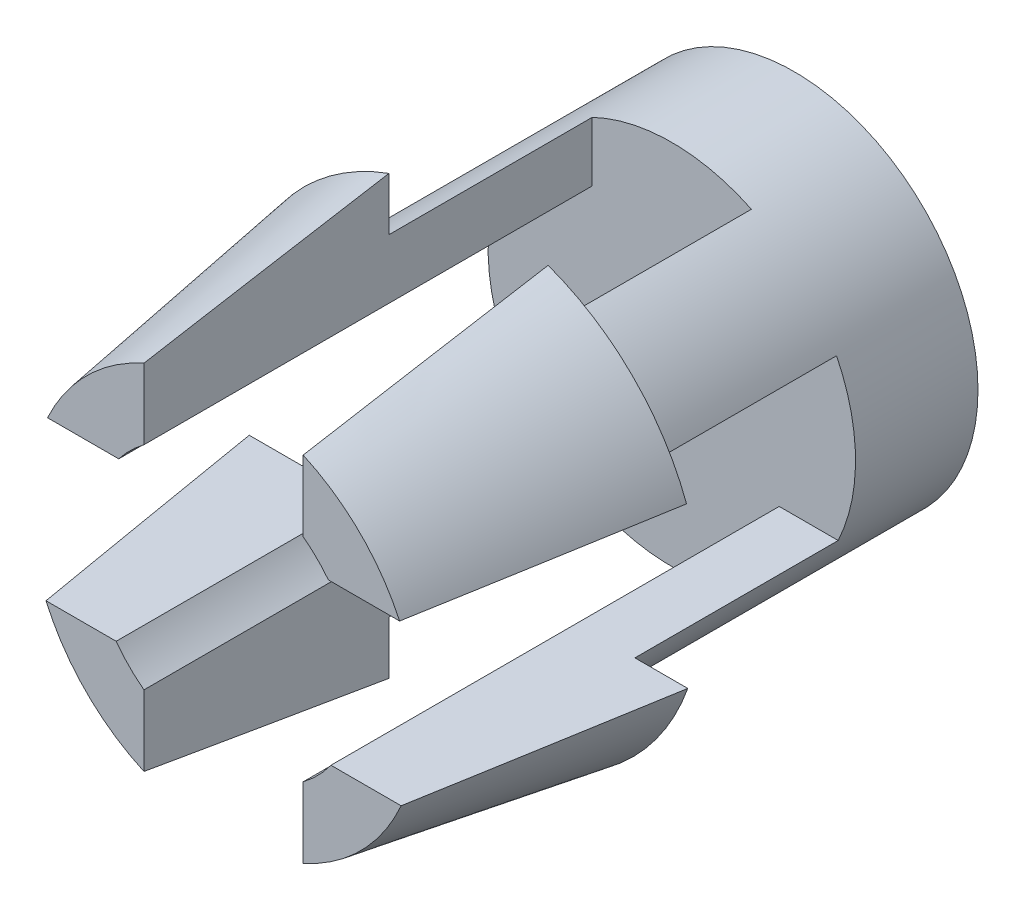
ISO-10303-21;
HEADER;
FILE_DESCRIPTION(('STEP AP214'),'2;1');
FILE_NAME('part.step','',(''),(''),'','','');
FILE_SCHEMA(('AUTOMOTIVE_DESIGN { 1 0 10303 214 1 1 1 1 }'));
ENDSEC;
DATA;
#1=APPLICATION_CONTEXT('core data for automotive mechanical design processes');
#2=APPLICATION_PROTOCOL_DEFINITION('international standard','automotive_design',2000,#1);
#3=PRODUCT_CONTEXT('',#1,'mechanical');
#4=PRODUCT('Part','Part','',(#3));
#5=PRODUCT_RELATED_PRODUCT_CATEGORY('part','',(#4));
#6=PRODUCT_DEFINITION_FORMATION('','',#4);
#7=PRODUCT_DEFINITION_CONTEXT('part definition',#1,'design');
#8=PRODUCT_DEFINITION('design','',#6,#7);
#9=PRODUCT_DEFINITION_SHAPE('','',#8);
#10=(LENGTH_UNIT() NAMED_UNIT(*) SI_UNIT(.MILLI.,.METRE.));
#11=(NAMED_UNIT(*) PLANE_ANGLE_UNIT() SI_UNIT($,.RADIAN.));
#12=(NAMED_UNIT(*) SI_UNIT($,.STERADIAN.) SOLID_ANGLE_UNIT());
#13=UNCERTAINTY_MEASURE_WITH_UNIT(LENGTH_MEASURE(1.E-05),#10,'distance_accuracy_value','');
#14=(GEOMETRIC_REPRESENTATION_CONTEXT(3) GLOBAL_UNCERTAINTY_ASSIGNED_CONTEXT((#13)) GLOBAL_UNIT_ASSIGNED_CONTEXT((#10,
#11,#12)) REPRESENTATION_CONTEXT('',''));
#15=CARTESIAN_POINT('',(0.,0.,0.));
#16=DIRECTION('',(0.,0.,1.));
#17=DIRECTION('',(1.,0.,0.));
#18=AXIS2_PLACEMENT_3D('',#15,#16,#17);
#19=CARTESIAN_POINT('',(0.,0.,2.66));
#20=DIRECTION('',(0.,0.,-1.));
#21=DIRECTION('',(1.,0.,0.));
#22=AXIS2_PLACEMENT_3D('',#19,#20,#21);
#23=CONICAL_SURFACE('',#22,1.9,0.15707963267949);
#24=CARTESIAN_POINT('',(0.,0.,4.66));
#25=DIRECTION('',(0.,0.,1.));
#26=DIRECTION('',(1.,0.,0.));
#27=AXIS2_PLACEMENT_3D('',#24,#25,#26);
#28=CIRCLE('',#27,1.58323111935093);
#29=CARTESIAN_POINT('',(-0.649990441567616,1.44365272941658,4.66));
#30=VERTEX_POINT('',#29);
#31=CARTESIAN_POINT('',(-1.43735556688669,0.663799481485955,4.66));
#32=VERTEX_POINT('',#31);
#33=EDGE_CURVE('E319',#30,#32,#28,.T.);
#34=ORIENTED_EDGE('',*,*,#33,.F.);
#35=CARTESIAN_POINT('',(-0.649990441567616,1.04026825747101,6.91142789484623));
#36=CARTESIAN_POINT('',(-0.649990441567616,1.07271581980736,6.73763839202195));
#37=CARTESIAN_POINT('',(-0.649990441567616,1.10477041161428,6.56377620600292));
#38=CARTESIAN_POINT('',(-0.649990441567616,1.16824072798636,6.2159360543328));
#39=CARTESIAN_POINT('',(-0.649990441567616,1.19965645570636,6.04195808925785));
#40=CARTESIAN_POINT('',(-0.649990441567616,1.29316533705953,5.51989840359639));
#41=CARTESIAN_POINT('',(-0.649990441567616,1.35452131131751,5.17168482375339));
#42=CARTESIAN_POINT('',(-0.649990441567616,1.47929104942674,4.45579494264743));
#43=CARTESIAN_POINT('',(-0.649990441567616,1.54263130932503,4.08810588273213));
#44=CARTESIAN_POINT('',(-0.649990441567616,1.66831512449735,3.35255704812285));
#45=CARTESIAN_POINT('',(-0.649990441567616,1.73065867807026,2.9846972731386));
#46=CARTESIAN_POINT('',(-0.649990441567616,1.85463218899445,2.24884306439396));
#47=CARTESIAN_POINT('',(-0.649990441567616,1.91626211866694,1.88084862597776));
#48=CARTESIAN_POINT('',(-0.649990441567616,2.03897507584477,1.14477047403916));
#49=CARTESIAN_POINT('',(-0.649990441567616,2.10005810615786,0.77668676098508));
#50=CARTESIAN_POINT('',(-0.649990441567616,2.16095257487143,0.408572105153766));
#51=B_SPLINE_CURVE_WITH_KNOTS('',3,(#35,#36,#37,#38,#39,#40,#41,#42,#43,#44,#45,#46,#47,#48,#49,
#50),.UNSPECIFIED.,.F.,.F.,(4,2,2,2,2,2,2,4),(0.,0.530376459828062,1.06075029993156,
2.12147946523772,3.24079231986124,4.36010708467656,5.47946511906578,6.59881740344116),.UNSPECIFIED.);
#52=CARTESIAN_POINT('',(-0.649990441567616,1.78536058707219,2.66));
#53=VERTEX_POINT('',#52);
#54=EDGE_CURVE('E210',#30,#53,#51,.T.);
#55=ORIENTED_EDGE('',*,*,#54,.T.);
#56=CARTESIAN_POINT('',(0.,0.,2.66));
#57=DIRECTION('',(0.,0.,1.));
#58=DIRECTION('',(1.,0.,0.));
#59=AXIS2_PLACEMENT_3D('',#56,#57,#58);
#60=CIRCLE('',#59,1.9);
#61=CARTESIAN_POINT('',(-1.7802725208178,0.663799481485955,2.66));
#62=VERTEX_POINT('',#61);
#63=EDGE_CURVE('E312',#53,#62,#60,.T.);
#64=ORIENTED_EDGE('',*,*,#63,.T.);
#65=CARTESIAN_POINT('',(-2.15755518599553,0.663799481485955,0.403717810966881));
#66=CARTESIAN_POINT('',(-2.10436709712215,0.663799481485955,0.724680989179397));
#67=CARTESIAN_POINT('',(-2.05101726012341,0.663799481485955,1.04561717405535));
#68=CARTESIAN_POINT('',(-1.94389786439463,0.663799481485955,1.6874200335076));
#69=CARTESIAN_POINT('',(-1.89012830494651,0.663799481485955,2.00828670796402));
#70=CARTESIAN_POINT('',(-1.72804953147308,0.663799481485955,2.97073643056123));
#71=CARTESIAN_POINT('',(-1.61896673653907,0.663799481485955,3.61219029126679));
#72=CARTESIAN_POINT('',(-1.46956536381484,0.663799481485955,4.47546894305173));
#73=CARTESIAN_POINT('',(-1.43089483642734,0.663799481485955,4.69757877256878));
#74=CARTESIAN_POINT('',(-1.35296542824469,0.663799481485955,5.14169469361843));
#75=CARTESIAN_POINT('',(-1.31370654894625,0.663799481485955,5.36370078541345));
#76=CARTESIAN_POINT('',(-1.23443635637332,0.663799481485955,5.80758413174877));
#77=CARTESIAN_POINT('',(-1.19442502644314,0.663799481485955,6.02946138332482));
#78=CARTESIAN_POINT('',(-1.1133626744567,0.663799481485955,6.47302758631472));
#79=CARTESIAN_POINT('',(-1.07231164361238,0.663799481485955,6.69471653612057));
#80=CARTESIAN_POINT('',(-1.03059704537114,0.663799481485955,6.91628218903312));
#81=B_SPLINE_CURVE_WITH_KNOTS('',3,(#65,#66,#67,#68,#69,#70,#71,#72,#73,#74,#75,#76,#77,#78,#79,
#80),.UNSPECIFIED.,.F.,.F.,(4,2,2,2,2,2,2,4),(0.,0.976020528674219,1.95204272752984,
3.90402292788747,4.58037553909581,5.25672643003116,5.93309230984007,6.60946390854012),.UNSPECIFIED.);
#82=EDGE_CURVE('E60',#62,#32,#81,.T.);
#83=ORIENTED_EDGE('',*,*,#82,.T.);
#84=EDGE_LOOP('',(#34,#55,#64,#83));
#85=FACE_BOUND('',#84,.T.);
#86=ADVANCED_FACE('F41',(#85),#23,.T.);
#87=CARTESIAN_POINT('',(1.78027608478363,0.663789923053571,2.66));
#88=VERTEX_POINT('',#87);
#89=CARTESIAN_POINT('',(0.649990441567616,1.78536058707219,2.66));
#90=VERTEX_POINT('',#89);
#91=EDGE_CURVE('E313',#88,#90,#60,.T.);
#92=ORIENTED_EDGE('',*,*,#91,.T.);
#93=CARTESIAN_POINT('',(0.649990441567616,2.16095257487143,0.408572105153766));
#94=CARTESIAN_POINT('',(0.649990441567616,2.10788170160067,0.729441634780256));
#95=CARTESIAN_POINT('',(0.649990441567616,2.05465655537157,1.05028547808168));
#96=CARTESIAN_POINT('',(0.649990441567616,1.94780630032528,1.69190706125485));
#97=CARTESIAN_POINT('',(0.649990441567616,1.89418119087443,2.01268480102103));
#98=CARTESIAN_POINT('',(0.649990441567616,1.73257221542798,2.97487636765033));
#99=CARTESIAN_POINT('',(0.649990441567616,1.62385158978802,3.61616742728607));
#100=CARTESIAN_POINT('',(0.649990441567616,1.47518564283983,4.47856147551242));
#101=CARTESIAN_POINT('',(0.649990441567616,1.43680542977239,4.69993411719278));
#102=CARTESIAN_POINT('',(0.649990441567616,1.35949186816837,5.14258235818298));
#103=CARTESIAN_POINT('',(0.649990441567616,1.32055852085794,5.36385795770681));
#104=CARTESIAN_POINT('',(0.649990441567616,1.24198648714576,5.80628879151753));
#105=CARTESIAN_POINT('',(0.649990441567616,1.202347786848,6.02744402334442));
#106=CARTESIAN_POINT('',(0.649990441567616,1.12210106235276,6.46958003987513));
#107=CARTESIAN_POINT('',(0.649990441567616,1.08149303101298,6.69056082328116));
#108=CARTESIAN_POINT('',(0.649990441567616,1.04026825747101,6.91142789484623));
#109=B_SPLINE_CURVE_WITH_KNOTS('',3,(#93,#94,#95,#96,#97,#98,#99,#100,#101,#102,#103,#104,#105,
#106,#107,#108),.UNSPECIFIED.,.F.,.F.,(4,2,2,2,2,2,2,4),(0.,0.975685968555653,1.95137348323706,
3.9026910920317,4.57671576574153,5.25073894554439,5.92477541886749,6.59881686020775),.UNSPECIFIED.);
#110=CARTESIAN_POINT('',(0.649990441567616,1.44365272941658,4.66));
#111=VERTEX_POINT('',#110);
#112=EDGE_CURVE('E535',#90,#111,#109,.T.);
#113=ORIENTED_EDGE('',*,*,#112,.T.);
#114=CARTESIAN_POINT('',(1.43735998112294,0.663789923053571,4.66));
#115=VERTEX_POINT('',#114);
#116=EDGE_CURVE('E316',#115,#111,#28,.T.);
#117=ORIENTED_EDGE('',*,*,#116,.F.);
#118=CARTESIAN_POINT('',(1.03060384798284,0.663789923053571,6.91627875917397));
#119=CARTESIAN_POINT('',(1.0633043380907,0.663789923053571,6.74264826885664));
#120=CARTESIAN_POINT('',(1.09558498008606,0.663789923053571,6.56893949737105));
#121=CARTESIAN_POINT('',(1.1594652600081,0.663789923053571,6.22139768945228));
#122=CARTESIAN_POINT('',(1.19106490178231,0.663789923053571,6.0475646537269));
#123=CARTESIAN_POINT('',(1.28507968139316,0.663789923053571,5.52593145755154));
#124=CARTESIAN_POINT('',(1.34671194124006,0.663789923053571,5.17799040834892));
#125=CARTESIAN_POINT('',(1.47218491844513,0.663789923053571,4.46143630184407));
#126=CARTESIAN_POINT('',(1.53594287650215,0.663789923053571,4.09280881545099));
#127=CARTESIAN_POINT('',(1.66240211714818,0.663789923053571,3.35537218564993));
#128=CARTESIAN_POINT('',(1.72510339771912,0.663789923053571,2.98656304189638));
#129=CARTESIAN_POINT('',(1.84975178082525,0.663789923053571,2.24880103528827));
#130=CARTESIAN_POINT('',(1.91169885041969,0.663789923053571,1.87984816687754));
#131=CARTESIAN_POINT('',(2.03501588638792,0.663789923053571,1.14184813952756));
#132=CARTESIAN_POINT('',(2.09638585609101,0.663789923053571,0.772800981144901));
#133=CARTESIAN_POINT('',(2.15755755838174,0.663789923053571,0.403721240826034));
#134=B_SPLINE_CURVE_WITH_KNOTS('',3,(#118,#119,#120,#121,#122,#123,#124,#125,#126,#127,#128,
#129,#130,#131,#132,#133),.UNSPECIFIED.,.F.,.F.,(4,2,2,2,2,2,2,4),(0.,0.530047230990889,
1.06009146653275,2.12015918728171,3.24245922897028,4.36476141380559,5.48711244147358,
6.60945699029144),.UNSPECIFIED.);
#135=EDGE_CURVE('E462',#115,#88,#134,.T.);
#136=ORIENTED_EDGE('',*,*,#135,.T.);
#137=EDGE_LOOP('',(#92,#113,#117,#136));
#138=FACE_BOUND('',#137,.T.);
#139=ADVANCED_FACE('F412',(#138),#23,.T.);
#140=CARTESIAN_POINT('',(0.649990441567616,-1.78536058707219,2.66));
#141=VERTEX_POINT('',#140);
#142=CARTESIAN_POINT('',(1.79032428970574,-0.63619096008166,2.66));
#143=VERTEX_POINT('',#142);
#144=EDGE_CURVE('E309',#141,#143,#60,.T.);
#145=ORIENTED_EDGE('',*,*,#144,.T.);
#146=CARTESIAN_POINT('',(2.16428678852829,-0.63619096008166,0.413227707974674));
#147=CARTESIAN_POINT('',(2.1113297954293,-0.63619096008166,0.734007675799111));
#148=CARTESIAN_POINT('',(2.05822576901763,-0.63619096008166,1.05476321769792));
#149=CARTESIAN_POINT('',(1.95163686016605,-0.63619096008166,1.69621147914047));
#150=CARTESIAN_POINT('',(1.8981519771695,-0.63619096008166,2.0169041985917));
#151=CARTESIAN_POINT('',(1.73699891773471,-0.63619096008166,2.97884889065982));
#152=CARTESIAN_POINT('',(1.62862955382598,-0.63619096008166,3.61998427523773));
#153=CARTESIAN_POINT('',(1.48067335791245,-0.63619096008166,4.48153046392248));
#154=CARTESIAN_POINT('',(1.4425719199156,-0.63619096008166,4.7021962299018));
#155=CARTESIAN_POINT('',(1.36584914282574,-0.63619096008166,5.14343698941876));
#156=CARTESIAN_POINT('',(1.32722780473703,-0.63619096008166,5.36401198313089));
#157=CARTESIAN_POINT('',(1.24932401764592,-0.63619096008166,5.80504952488986));
#158=CARTESIAN_POINT('',(1.21004155705838,-0.63619096008166,6.02551207089634));
#159=CARTESIAN_POINT('',(1.13057276765082,-0.63619096008166,6.46627548734247));
#160=CARTESIAN_POINT('',(1.09038643302471,-0.63619096008166,6.6865763567342));
#161=CARTESIAN_POINT('',(1.04962670272732,-0.63619096008166,6.90677229202533));
#162=B_SPLINE_CURVE_WITH_KNOTS('',3,(#146,#147,#148,#149,#150,#151,#152,#153,#154,#155,#156,
#157,#158,#159,#160,#161),.UNSPECIFIED.,.F.,.F.,(4,2,2,2,2,2,2,4),(0.,0.975365223456879,
1.95073187275791,3.90141385589588,4.57320642722309,5.24499770101755,5.91680075919526,
6.58860813396334),.UNSPECIFIED.);
#163=CARTESIAN_POINT('',(1.44978682556835,-0.63619096008166,4.66));
#164=VERTEX_POINT('',#163);
#165=EDGE_CURVE('E449',#143,#164,#162,.T.);
#166=ORIENTED_EDGE('',*,*,#165,.T.);
#167=CARTESIAN_POINT('',(0.649990441567616,-1.44365272941658,4.66));
#168=VERTEX_POINT('',#167);
#169=EDGE_CURVE('E314',#168,#164,#28,.T.);
#170=ORIENTED_EDGE('',*,*,#169,.F.);
#171=CARTESIAN_POINT('',(0.649990441567616,-1.04026825747101,6.91142789484623));
#172=CARTESIAN_POINT('',(0.649990441567616,-1.07271581980736,6.73763839202195));
#173=CARTESIAN_POINT('',(0.649990441567616,-1.10477041161428,6.56377620600291));
#174=CARTESIAN_POINT('',(0.649990441567616,-1.16824072798636,6.2159360543328));
#175=CARTESIAN_POINT('',(0.649990441567616,-1.19965645570636,6.04195808925784));
#176=CARTESIAN_POINT('',(0.649990441567616,-1.29316533705953,5.51989840359639));
#177=CARTESIAN_POINT('',(0.649990441567616,-1.35452131131751,5.17168482375339));
#178=CARTESIAN_POINT('',(0.649990441567616,-1.47929104942674,4.45579494264743));
#179=CARTESIAN_POINT('',(0.649990441567616,-1.54263130932503,4.08810588273213));
#180=CARTESIAN_POINT('',(0.649990441567616,-1.66831512449735,3.35255704812285));
#181=CARTESIAN_POINT('',(0.649990441567616,-1.73065867807026,2.9846972731386));
#182=CARTESIAN_POINT('',(0.649990441567616,-1.85463218899445,2.24884306439396));
#183=CARTESIAN_POINT('',(0.649990441567616,-1.91626211866694,1.88084862597776));
#184=CARTESIAN_POINT('',(0.649990441567616,-2.03897507584477,1.14477047403916));
#185=CARTESIAN_POINT('',(0.649990441567616,-2.10005810615786,0.776686760985079));
#186=CARTESIAN_POINT('',(0.649990441567616,-2.16095257487143,0.408572105153767));
#187=B_SPLINE_CURVE_WITH_KNOTS('',3,(#171,#172,#173,#174,#175,#176,#177,#178,#179,#180,#181,
#182,#183,#184,#185,#186),.UNSPECIFIED.,.F.,.F.,(4,2,2,2,2,2,2,4),(0.,0.530376459828063,
1.06075029993156,2.12147946523772,3.24079231986124,4.36010708467656,5.47946511906578,
6.59881740344116),.UNSPECIFIED.);
#188=EDGE_CURVE('E450',#168,#141,#187,.T.);
#189=ORIENTED_EDGE('',*,*,#188,.T.);
#190=EDGE_LOOP('',(#145,#166,#170,#189));
#191=FACE_BOUND('',#190,.T.);
#192=ADVANCED_FACE('F423',(#191),#23,.T.);
#193=CARTESIAN_POINT('',(0.,0.,4.66));
#194=DIRECTION('',(0.,0.,1.));
#195=DIRECTION('',(1.,0.,0.));
#196=AXIS2_PLACEMENT_3D('',#193,#194,#195);
#197=PLANE('',#196);
#198=DIRECTION('',(0.,-1.,0.));
#199=VECTOR('',#198,1.);
#200=CARTESIAN_POINT('',(-0.649990441567616,0.86654606559663,4.66));
#201=LINE('',#200,#199);
#202=CARTESIAN_POINT('',(-0.649990441567616,0.86654606559663,4.66));
#203=VERTEX_POINT('',#202);
#204=EDGE_CURVE('E205',#30,#203,#201,.T.);
#205=ORIENTED_EDGE('',*,*,#204,.F.);
#206=ORIENTED_EDGE('',*,*,#33,.T.);
#207=DIRECTION('',(-1.,0.,0.));
#208=VECTOR('',#207,1.);
#209=CARTESIAN_POINT('',(-2.3813094820765,0.663799481485955,4.66));
#210=LINE('',#209,#208);
#211=CARTESIAN_POINT('',(-0.856013963851782,0.663799481485955,4.66));
#212=VERTEX_POINT('',#211);
#213=EDGE_CURVE('E229',#212,#32,#210,.T.);
#214=ORIENTED_EDGE('',*,*,#213,.F.);
#215=CARTESIAN_POINT('',(0.,0.,4.66));
#216=DIRECTION('',(0.,0.,1.));
#217=DIRECTION('',(1.,0.,0.));
#218=AXIS2_PLACEMENT_3D('',#215,#216,#217);
#219=CIRCLE('',#218,1.08323111935093);
#220=EDGE_CURVE('E215',#203,#212,#219,.T.);
#221=ORIENTED_EDGE('',*,*,#220,.F.);
#222=EDGE_LOOP('',(#205,#206,#214,#221));
#223=FACE_BOUND('',#222,.T.);
#224=ADVANCED_FACE('F223',(#223),#197,.T.);
#225=DIRECTION('',(1.,0.,0.));
#226=VECTOR('',#225,1.);
#227=CARTESIAN_POINT('',(-0.876720342054822,-0.636200518514044,4.66));
#228=LINE('',#227,#226);
#229=CARTESIAN_POINT('',(-1.44978263112911,-0.636200518514044,4.66));
#230=VERTEX_POINT('',#229);
#231=CARTESIAN_POINT('',(-0.876720342054823,-0.636200518514044,4.66));
#232=VERTEX_POINT('',#231);
#233=EDGE_CURVE('E230',#230,#232,#228,.T.);
#234=ORIENTED_EDGE('',*,*,#233,.F.);
#235=CARTESIAN_POINT('',(-0.649990441567615,-1.44365272941658,4.66));
#236=VERTEX_POINT('',#235);
#237=EDGE_CURVE('E509',#230,#236,#28,.T.);
#238=ORIENTED_EDGE('',*,*,#237,.T.);
#239=DIRECTION('',(0.,-1.,0.));
#240=VECTOR('',#239,1.);
#241=CARTESIAN_POINT('',(-0.649990441567615,-2.22131665134692,4.66));
#242=LINE('',#241,#240);
#243=CARTESIAN_POINT('',(-0.649990441567615,-0.866546065596631,4.66));
#244=VERTEX_POINT('',#243);
#245=EDGE_CURVE('E237',#244,#236,#242,.T.);
#246=ORIENTED_EDGE('',*,*,#245,.F.);
#247=CARTESIAN_POINT('',(0.,0.,4.66));
#248=DIRECTION('',(0.,0.,1.));
#249=DIRECTION('',(1.,0.,0.));
#250=AXIS2_PLACEMENT_3D('',#247,#248,#249);
#251=CIRCLE('',#250,1.08323111935093);
#252=EDGE_CURVE('E231',#232,#244,#251,.T.);
#253=ORIENTED_EDGE('',*,*,#252,.F.);
#254=EDGE_LOOP('',(#234,#238,#246,#253));
#255=FACE_BOUND('',#254,.T.);
#256=ADVANCED_FACE('F439',(#255),#197,.T.);
#257=DIRECTION('',(0.,1.,0.));
#258=VECTOR('',#257,1.);
#259=CARTESIAN_POINT('',(0.649990441567616,-0.866546065596631,4.66));
#260=LINE('',#259,#258);
#261=CARTESIAN_POINT('',(0.649990441567616,-0.866546065596631,4.66));
#262=VERTEX_POINT('',#261);
#263=EDGE_CURVE('E236',#168,#262,#260,.T.);
#264=ORIENTED_EDGE('',*,*,#263,.F.);
#265=ORIENTED_EDGE('',*,*,#169,.T.);
#266=DIRECTION('',(1.,0.,0.));
#267=VECTOR('',#266,1.);
#268=CARTESIAN_POINT('',(2.3813094820765,-0.63619096008166,4.66));
#269=LINE('',#268,#267);
#270=CARTESIAN_POINT('',(0.876727278143345,-0.63619096008166,4.66));
#271=VERTEX_POINT('',#270);
#272=EDGE_CURVE('E245',#271,#164,#269,.T.);
#273=ORIENTED_EDGE('',*,*,#272,.F.);
#274=CARTESIAN_POINT('',(0.,0.,4.66));
#275=DIRECTION('',(0.,0.,1.));
#276=DIRECTION('',(1.,0.,0.));
#277=AXIS2_PLACEMENT_3D('',#274,#275,#276);
#278=CIRCLE('',#277,1.08323111935093);
#279=EDGE_CURVE('E238',#262,#271,#278,.T.);
#280=ORIENTED_EDGE('',*,*,#279,.F.);
#281=EDGE_LOOP('',(#264,#265,#273,#280));
#282=FACE_BOUND('',#281,.T.);
#283=ADVANCED_FACE('F435',(#282),#197,.T.);
#284=CARTESIAN_POINT('',(0.,0.,2.66));
#285=DIRECTION('',(0.,0.,1.));
#286=DIRECTION('',(1.,0.,0.));
#287=AXIS2_PLACEMENT_3D('',#284,#285,#286);
#288=PLANE('',#287);
#289=ORIENTED_EDGE('',*,*,#63,.F.);
#290=DIRECTION('',(0.,-1.,0.));
#291=VECTOR('',#290,1.);
#292=CARTESIAN_POINT('',(-0.649990441567616,0.,2.66));
#293=LINE('',#292,#291);
#294=CARTESIAN_POINT('',(-0.649990441567616,1.35185517932608,2.66));
#295=VERTEX_POINT('',#294);
#296=EDGE_CURVE('E350',#53,#295,#293,.T.);
#297=ORIENTED_EDGE('',*,*,#296,.T.);
#298=CARTESIAN_POINT('',(0.,0.,2.66));
#299=DIRECTION('',(0.,0.,1.));
#300=DIRECTION('',(1.,0.,0.));
#301=AXIS2_PLACEMENT_3D('',#298,#299,#300);
#302=CIRCLE('',#301,1.5);
#303=CARTESIAN_POINT('',(-1.34512833899929,0.663799481485955,2.66));
#304=VERTEX_POINT('',#303);
#305=EDGE_CURVE('E324',#295,#304,#302,.T.);
#306=ORIENTED_EDGE('',*,*,#305,.T.);
#307=DIRECTION('',(-1.,0.,0.));
#308=VECTOR('',#307,1.);
#309=CARTESIAN_POINT('',(0.,0.663799481485955,2.66));
#310=LINE('',#309,#308);
#311=EDGE_CURVE('E322',#304,#62,#310,.T.);
#312=ORIENTED_EDGE('',*,*,#311,.T.);
#313=EDGE_LOOP('',(#289,#297,#306,#312));
#314=FACE_BOUND('',#313,.T.);
#315=ADVANCED_FACE('F451',(#314),#288,.F.);
#316=CARTESIAN_POINT('',(1.3451330558917,0.663789923053571,2.66));
#317=VERTEX_POINT('',#316);
#318=CARTESIAN_POINT('',(0.649990441567616,1.35185517932608,2.66));
#319=VERTEX_POINT('',#318);
#320=EDGE_CURVE('E321',#317,#319,#302,.T.);
#321=ORIENTED_EDGE('',*,*,#320,.T.);
#322=DIRECTION('',(0.,1.,0.));
#323=VECTOR('',#322,1.);
#324=CARTESIAN_POINT('',(0.649990441567617,0.,2.66));
#325=LINE('',#324,#323);
#326=EDGE_CURVE('E342',#319,#90,#325,.T.);
#327=ORIENTED_EDGE('',*,*,#326,.T.);
#328=ORIENTED_EDGE('',*,*,#91,.F.);
#329=DIRECTION('',(-1.,0.,0.));
#330=VECTOR('',#329,1.);
#331=CARTESIAN_POINT('',(0.,0.663789923053571,2.66));
#332=LINE('',#331,#330);
#333=EDGE_CURVE('E345',#88,#317,#332,.T.);
#334=ORIENTED_EDGE('',*,*,#333,.T.);
#335=EDGE_LOOP('',(#321,#327,#328,#334));
#336=FACE_BOUND('',#335,.T.);
#337=ADVANCED_FACE('F534',(#336),#288,.F.);
#338=CARTESIAN_POINT('',(0.649990441567616,-1.35185517932608,2.66));
#339=VERTEX_POINT('',#338);
#340=CARTESIAN_POINT('',(1.35840386568589,-0.63619096008166,2.66));
#341=VERTEX_POINT('',#340);
#342=EDGE_CURVE('E326',#339,#341,#302,.T.);
#343=ORIENTED_EDGE('',*,*,#342,.T.);
#344=DIRECTION('',(1.,0.,0.));
#345=VECTOR('',#344,1.);
#346=CARTESIAN_POINT('',(0.,-0.63619096008166,2.66));
#347=LINE('',#346,#345);
#348=EDGE_CURVE('E338',#341,#143,#347,.T.);
#349=ORIENTED_EDGE('',*,*,#348,.T.);
#350=ORIENTED_EDGE('',*,*,#144,.F.);
#351=DIRECTION('',(0.,1.,0.));
#352=VECTOR('',#351,1.);
#353=CARTESIAN_POINT('',(0.649990441567616,0.,2.66));
#354=LINE('',#353,#352);
#355=EDGE_CURVE('E339',#141,#339,#354,.T.);
#356=ORIENTED_EDGE('',*,*,#355,.T.);
#357=EDGE_LOOP('',(#343,#349,#350,#356));
#358=FACE_BOUND('',#357,.T.);
#359=ADVANCED_FACE('F456',(#358),#288,.F.);
#360=CARTESIAN_POINT('',(0.,0.,2.66));
#361=DIRECTION('',(0.,0.,-1.));
#362=DIRECTION('',(-1.,0.,0.));
#363=AXIS2_PLACEMENT_3D('',#360,#361,#362);
#364=CYLINDRICAL_SURFACE('',#363,1.5);
#365=ORIENTED_EDGE('',*,*,#305,.F.);
#366=DIRECTION('',(0.,0.,-1.));
#367=VECTOR('',#366,1.);
#368=CARTESIAN_POINT('',(-0.649990441567616,1.35185517932608,2.66));
#369=LINE('',#368,#367);
#370=CARTESIAN_POINT('',(-0.649990441567616,1.35185517932608,1.));
#371=VERTEX_POINT('',#370);
#372=EDGE_CURVE('E62',#295,#371,#369,.T.);
#373=ORIENTED_EDGE('',*,*,#372,.T.);
#374=CARTESIAN_POINT('',(0.,0.,1.));
#375=DIRECTION('',(0.,0.,1.));
#376=DIRECTION('',(1.,0.,0.));
#377=AXIS2_PLACEMENT_3D('',#374,#375,#376);
#378=CIRCLE('',#377,1.5);
#379=CARTESIAN_POINT('',(0.649990441567616,1.35185517932608,1.));
#380=VERTEX_POINT('',#379);
#381=EDGE_CURVE('E12',#380,#371,#378,.T.);
#382=ORIENTED_EDGE('',*,*,#381,.F.);
#383=DIRECTION('',(0.,0.,-1.));
#384=VECTOR('',#383,1.);
#385=CARTESIAN_POINT('',(0.649990441567616,1.35185517932608,2.66));
#386=LINE('',#385,#384);
#387=EDGE_CURVE('E307',#380,#319,#386,.F.);
#388=ORIENTED_EDGE('',*,*,#387,.T.);
#389=ORIENTED_EDGE('',*,*,#320,.F.);
#390=DIRECTION('',(0.,0.,-1.));
#391=VECTOR('',#390,1.);
#392=CARTESIAN_POINT('',(1.3451330558917,0.663789923053571,2.66));
#393=LINE('',#392,#391);
#394=CARTESIAN_POINT('',(1.3451330558917,0.663789923053571,1.));
#395=VERTEX_POINT('',#394);
#396=EDGE_CURVE('E466',#317,#395,#393,.T.);
#397=ORIENTED_EDGE('',*,*,#396,.T.);
#398=CARTESIAN_POINT('',(1.35840386568589,-0.63619096008166,1.));
#399=VERTEX_POINT('',#398);
#400=EDGE_CURVE('E44',#399,#395,#378,.T.);
#401=ORIENTED_EDGE('',*,*,#400,.F.);
#402=DIRECTION('',(0.,0.,-1.));
#403=VECTOR('',#402,1.);
#404=CARTESIAN_POINT('',(1.35840386568589,-0.63619096008166,2.66));
#405=LINE('',#404,#403);
#406=EDGE_CURVE('E461',#399,#341,#405,.F.);
#407=ORIENTED_EDGE('',*,*,#406,.T.);
#408=ORIENTED_EDGE('',*,*,#342,.F.);
#409=DIRECTION('',(0.,0.,-1.));
#410=VECTOR('',#409,1.);
#411=CARTESIAN_POINT('',(0.649990441567616,-1.35185517932608,2.66));
#412=LINE('',#411,#410);
#413=CARTESIAN_POINT('',(0.649990441567616,-1.35185517932608,1.));
#414=VERTEX_POINT('',#413);
#415=EDGE_CURVE('E464',#339,#414,#412,.T.);
#416=ORIENTED_EDGE('',*,*,#415,.T.);
#417=CARTESIAN_POINT('',(-0.649990441567615,-1.35185517932608,1.));
#418=VERTEX_POINT('',#417);
#419=EDGE_CURVE('E351',#418,#414,#378,.T.);
#420=ORIENTED_EDGE('',*,*,#419,.F.);
#421=DIRECTION('',(0.,0.,-1.));
#422=VECTOR('',#421,1.);
#423=CARTESIAN_POINT('',(-0.649990441567615,-1.35185517932608,2.66));
#424=LINE('',#423,#422);
#425=CARTESIAN_POINT('',(-0.649990441567615,-1.35185517932608,2.66));
#426=VERTEX_POINT('',#425);
#427=EDGE_CURVE('E384',#418,#426,#424,.F.);
#428=ORIENTED_EDGE('',*,*,#427,.T.);
#429=CARTESIAN_POINT('',(-1.35839938907615,-0.636200518514044,2.66));
#430=VERTEX_POINT('',#429);
#431=EDGE_CURVE('E379',#430,#426,#302,.T.);
#432=ORIENTED_EDGE('',*,*,#431,.F.);
#433=DIRECTION('',(0.,0.,-1.));
#434=VECTOR('',#433,1.);
#435=CARTESIAN_POINT('',(-1.35839938907615,-0.636200518514044,2.66));
#436=LINE('',#435,#434);
#437=CARTESIAN_POINT('',(-1.35839938907615,-0.636200518514044,1.));
#438=VERTEX_POINT('',#437);
#439=EDGE_CURVE('E373',#430,#438,#436,.T.);
#440=ORIENTED_EDGE('',*,*,#439,.T.);
#441=CARTESIAN_POINT('',(-1.34512833899929,0.663799481485955,1.));
#442=VERTEX_POINT('',#441);
#443=EDGE_CURVE('E49',#442,#438,#378,.T.);
#444=ORIENTED_EDGE('',*,*,#443,.F.);
#445=DIRECTION('',(0.,0.,-1.));
#446=VECTOR('',#445,1.);
#447=CARTESIAN_POINT('',(-1.34512833899929,0.663799481485955,2.66));
#448=LINE('',#447,#446);
#449=EDGE_CURVE('E280',#442,#304,#448,.F.);
#450=ORIENTED_EDGE('',*,*,#449,.T.);
#451=EDGE_LOOP('',(#365,#373,#382,#388,#389,#397,#401,#407,#408,#416,#420,#428,#432,#440,#444,#450));
#452=FACE_BOUND('',#451,.T.);
#453=CARTESIAN_POINT('',(0.,0.,0.));
#454=DIRECTION('',(0.,0.,1.));
#455=DIRECTION('',(1.,0.,0.));
#456=AXIS2_PLACEMENT_3D('',#453,#454,#455);
#457=CIRCLE('',#456,1.5);
#458=CARTESIAN_POINT('',(1.5,0.,0.));
#459=VERTEX_POINT('',#458);
#460=EDGE_CURVE('E317',#459,#459,#457,.T.);
#461=ORIENTED_EDGE('',*,*,#460,.T.);
#462=EDGE_LOOP('',(#461));
#463=FACE_BOUND('',#462,.T.);
#464=ADVANCED_FACE('F43',(#452,#463),#364,.T.);
#465=CARTESIAN_POINT('',(0.,0.,0.));
#466=DIRECTION('',(0.,0.,1.));
#467=DIRECTION('',(1.,0.,0.));
#468=AXIS2_PLACEMENT_3D('',#465,#466,#467);
#469=PLANE('',#468);
#470=ORIENTED_EDGE('',*,*,#460,.F.);
#471=EDGE_LOOP('',(#470));
#472=FACE_BOUND('',#471,.T.);
#473=ADVANCED_FACE('F424',(#472),#469,.F.);
#474=CARTESIAN_POINT('',(-1.7903208930922,-0.636200518514044,2.66));
#475=VERTEX_POINT('',#474);
#476=CARTESIAN_POINT('',(-0.649990441567615,-1.78536058707219,2.66));
#477=VERTEX_POINT('',#476);
#478=EDGE_CURVE('E447',#475,#477,#60,.T.);
#479=ORIENTED_EDGE('',*,*,#478,.T.);
#480=CARTESIAN_POINT('',(-0.649990441567615,-2.16095257487143,0.408572105153764));
#481=CARTESIAN_POINT('',(-0.649990441567615,-2.10788170160067,0.729441634780255));
#482=CARTESIAN_POINT('',(-0.649990441567615,-2.05465655537157,1.05028547808168));
#483=CARTESIAN_POINT('',(-0.649990441567615,-1.94780630032528,1.69190706125484));
#484=CARTESIAN_POINT('',(-0.649990441567615,-1.89418119087443,2.01268480102103));
#485=CARTESIAN_POINT('',(-0.649990441567615,-1.73257221542798,2.97487636765033));
#486=CARTESIAN_POINT('',(-0.649990441567615,-1.62385158978802,3.61616742728607));
#487=CARTESIAN_POINT('',(-0.649990441567615,-1.47518564283983,4.47856147551242));
#488=CARTESIAN_POINT('',(-0.649990441567615,-1.43680542977239,4.69993411719278));
#489=CARTESIAN_POINT('',(-0.649990441567615,-1.35949186816837,5.14258235818298));
#490=CARTESIAN_POINT('',(-0.649990441567615,-1.32055852085794,5.36385795770681));
#491=CARTESIAN_POINT('',(-0.649990441567615,-1.24198648714576,5.80628879151753));
#492=CARTESIAN_POINT('',(-0.649990441567615,-1.202347786848,6.02744402334442));
#493=CARTESIAN_POINT('',(-0.649990441567615,-1.12210106235276,6.46958003987513));
#494=CARTESIAN_POINT('',(-0.649990441567615,-1.08149303101298,6.69056082328116));
#495=CARTESIAN_POINT('',(-0.649990441567615,-1.04026825747101,6.91142789484623));
#496=B_SPLINE_CURVE_WITH_KNOTS('',3,(#480,#481,#482,#483,#484,#485,#486,#487,#488,#489,#490,
#491,#492,#493,#494,#495),.UNSPECIFIED.,.F.,.F.,(4,2,2,2,2,2,2,4),(0.,0.975685968555653,
1.95137348323706,3.9026910920317,4.57671576574153,5.25073894554439,5.92477541886749,
6.59881686020775),.UNSPECIFIED.);
#497=EDGE_CURVE('E381',#477,#236,#496,.T.);
#498=ORIENTED_EDGE('',*,*,#497,.T.);
#499=ORIENTED_EDGE('',*,*,#237,.F.);
#500=CARTESIAN_POINT('',(-1.04962032407066,-0.636200518514044,6.90677545129568));
#501=CARTESIAN_POINT('',(-1.08182700505953,-0.636200518514044,6.73283408979058));
#502=CARTESIAN_POINT('',(-1.11366584626398,-0.636200518514044,6.55882521675285));
#503=CARTESIAN_POINT('',(-1.1767442101374,-0.636200518514044,6.21069957276478));
#504=CARTESIAN_POINT('',(-1.20798373539341,-0.636200518514044,6.03658280228356));
#505=CARTESIAN_POINT('',(-1.30100732392779,-0.636200518514044,5.51411449574116));
#506=CARTESIAN_POINT('',(-1.36209739337178,-0.636200518514044,5.16563955193779));
#507=CARTESIAN_POINT('',(-1.48619206770605,-0.636200518514044,4.45038688216392));
#508=CARTESIAN_POINT('',(-1.54913148605634,-0.636200518514044,4.08359788975369));
#509=CARTESIAN_POINT('',(-1.67407049557635,-0.636200518514044,3.34985950854662));
#510=CARTESIAN_POINT('',(-1.73607008531409,-0.636200518514044,2.98291011950628));
#511=CARTESIAN_POINT('',(-1.85939437631746,-0.636200518514044,2.24888517196117));
#512=CARTESIAN_POINT('',(-1.92071905434803,-0.636200518514044,1.8818096095585));
#513=CARTESIAN_POINT('',(-2.04285039125597,-0.636200518514044,1.14757400320453));
#514=CARTESIAN_POINT('',(-2.10365705249821,-0.636200518514044,0.78041395964677));
#515=CARTESIAN_POINT('',(-2.16428450035926,-0.636200518514045,0.413224548704315));
#516=B_SPLINE_CURVE_WITH_KNOTS('',3,(#500,#501,#502,#503,#504,#505,#506,#507,#508,#509,#510,
#511,#512,#513,#514,#515),.UNSPECIFIED.,.F.,.F.,(4,2,2,2,2,2,2,4),(0.,0.530692445949576,
1.06138260057099,2.1227464009274,3.23919452880426,4.35564435759494,5.4721325027315,
6.58861554810676),.UNSPECIFIED.);
#517=EDGE_CURVE('E385',#230,#475,#516,.T.);
#518=ORIENTED_EDGE('',*,*,#517,.T.);
#519=EDGE_LOOP('',(#479,#498,#499,#518));
#520=FACE_BOUND('',#519,.T.);
#521=ADVANCED_FACE('F276',(#520),#23,.T.);
#522=DIRECTION('',(-1.,0.,0.));
#523=VECTOR('',#522,1.);
#524=CARTESIAN_POINT('',(0.856021375891279,0.663789923053571,4.66));
#525=LINE('',#524,#523);
#526=CARTESIAN_POINT('',(0.856021375891279,0.663789923053571,4.66));
#527=VERTEX_POINT('',#526);
#528=EDGE_CURVE('E242',#115,#527,#525,.T.);
#529=ORIENTED_EDGE('',*,*,#528,.F.);
#530=ORIENTED_EDGE('',*,*,#116,.T.);
#531=DIRECTION('',(0.,1.,0.));
#532=VECTOR('',#531,1.);
#533=CARTESIAN_POINT('',(0.649990441567616,2.22131665134692,4.66));
#534=LINE('',#533,#532);
#535=CARTESIAN_POINT('',(0.649990441567616,0.866546065596631,4.66));
#536=VERTEX_POINT('',#535);
#537=EDGE_CURVE('E224',#536,#111,#534,.T.);
#538=ORIENTED_EDGE('',*,*,#537,.F.);
#539=CARTESIAN_POINT('',(0.,0.,4.66));
#540=DIRECTION('',(0.,0.,1.));
#541=DIRECTION('',(1.,0.,0.));
#542=AXIS2_PLACEMENT_3D('',#539,#540,#541);
#543=CIRCLE('',#542,1.08323111935093);
#544=EDGE_CURVE('E250',#527,#536,#543,.T.);
#545=ORIENTED_EDGE('',*,*,#544,.F.);
#546=EDGE_LOOP('',(#529,#530,#538,#545));
#547=FACE_BOUND('',#546,.T.);
#548=ADVANCED_FACE('F298',(#547),#197,.T.);
#549=ORIENTED_EDGE('',*,*,#431,.T.);
#550=DIRECTION('',(0.,-1.,0.));
#551=VECTOR('',#550,1.);
#552=CARTESIAN_POINT('',(-0.649990441567615,0.,2.66));
#553=LINE('',#552,#551);
#554=EDGE_CURVE('E334',#426,#477,#553,.T.);
#555=ORIENTED_EDGE('',*,*,#554,.T.);
#556=ORIENTED_EDGE('',*,*,#478,.F.);
#557=DIRECTION('',(1.,0.,0.));
#558=VECTOR('',#557,1.);
#559=CARTESIAN_POINT('',(0.,-0.636200518514044,2.66));
#560=LINE('',#559,#558);
#561=EDGE_CURVE('E329',#475,#430,#560,.T.);
#562=ORIENTED_EDGE('',*,*,#561,.T.);
#563=EDGE_LOOP('',(#549,#555,#556,#562));
#564=FACE_BOUND('',#563,.T.);
#565=ADVANCED_FACE('F429',(#564),#288,.F.);
#566=CARTESIAN_POINT('',(0.,0.,1.));
#567=DIRECTION('',(0.,0.,1.));
#568=DIRECTION('',(1.,0.,0.));
#569=AXIS2_PLACEMENT_3D('',#566,#567,#568);
#570=PLANE('',#569);
#571=ORIENTED_EDGE('',*,*,#381,.T.);
#572=DIRECTION('',(0.,1.,0.));
#573=VECTOR('',#572,1.);
#574=CARTESIAN_POINT('',(-0.649990441567616,0.86654606559663,1.));
#575=LINE('',#574,#573);
#576=CARTESIAN_POINT('',(-0.649990441567616,0.86654606559663,1.));
#577=VERTEX_POINT('',#576);
#578=EDGE_CURVE('E267',#577,#371,#575,.T.);
#579=ORIENTED_EDGE('',*,*,#578,.F.);
#580=CARTESIAN_POINT('',(0.,0.,1.));
#581=DIRECTION('',(0.,0.,1.));
#582=DIRECTION('',(1.,0.,0.));
#583=AXIS2_PLACEMENT_3D('',#580,#581,#582);
#584=CIRCLE('',#583,1.08323111935093);
#585=CARTESIAN_POINT('',(-0.856013963851782,0.663799481485955,1.));
#586=VERTEX_POINT('',#585);
#587=EDGE_CURVE('E219',#586,#577,#584,.F.);
#588=ORIENTED_EDGE('',*,*,#587,.F.);
#589=DIRECTION('',(1.,0.,0.));
#590=VECTOR('',#589,1.);
#591=CARTESIAN_POINT('',(-2.3813094820765,0.663799481485955,1.));
#592=LINE('',#591,#590);
#593=EDGE_CURVE('E251',#442,#586,#592,.T.);
#594=ORIENTED_EDGE('',*,*,#593,.F.);
#595=ORIENTED_EDGE('',*,*,#443,.T.);
#596=DIRECTION('',(-1.,0.,0.));
#597=VECTOR('',#596,1.);
#598=CARTESIAN_POINT('',(-0.876720342054822,-0.636200518514044,1.));
#599=LINE('',#598,#597);
#600=CARTESIAN_POINT('',(-0.876720342054823,-0.636200518514044,1.));
#601=VERTEX_POINT('',#600);
#602=EDGE_CURVE('E370',#601,#438,#599,.T.);
#603=ORIENTED_EDGE('',*,*,#602,.F.);
#604=CARTESIAN_POINT('',(0.,0.,1.));
#605=DIRECTION('',(0.,0.,1.));
#606=DIRECTION('',(1.,0.,0.));
#607=AXIS2_PLACEMENT_3D('',#604,#605,#606);
#608=CIRCLE('',#607,1.08323111935093);
#609=CARTESIAN_POINT('',(-0.649990441567615,-0.866546065596631,1.));
#610=VERTEX_POINT('',#609);
#611=EDGE_CURVE('E372',#610,#601,#608,.F.);
#612=ORIENTED_EDGE('',*,*,#611,.F.);
#613=DIRECTION('',(0.,1.,0.));
#614=VECTOR('',#613,1.);
#615=CARTESIAN_POINT('',(-0.649990441567615,-2.22131665134692,1.));
#616=LINE('',#615,#614);
#617=EDGE_CURVE('E516',#418,#610,#616,.T.);
#618=ORIENTED_EDGE('',*,*,#617,.F.);
#619=ORIENTED_EDGE('',*,*,#419,.T.);
#620=DIRECTION('',(0.,-1.,0.));
#621=VECTOR('',#620,1.);
#622=CARTESIAN_POINT('',(0.649990441567616,-0.866546065596631,1.));
#623=LINE('',#622,#621);
#624=CARTESIAN_POINT('',(0.649990441567616,-0.866546065596631,1.));
#625=VERTEX_POINT('',#624);
#626=EDGE_CURVE('E501',#625,#414,#623,.T.);
#627=ORIENTED_EDGE('',*,*,#626,.F.);
#628=CARTESIAN_POINT('',(0.,0.,1.));
#629=DIRECTION('',(0.,0.,1.));
#630=DIRECTION('',(1.,0.,0.));
#631=AXIS2_PLACEMENT_3D('',#628,#629,#630);
#632=CIRCLE('',#631,1.08323111935093);
#633=CARTESIAN_POINT('',(0.876727278143346,-0.636190960081661,1.));
#634=VERTEX_POINT('',#633);
#635=EDGE_CURVE('E498',#634,#625,#632,.F.);
#636=ORIENTED_EDGE('',*,*,#635,.F.);
#637=DIRECTION('',(-1.,0.,0.));
#638=VECTOR('',#637,1.);
#639=CARTESIAN_POINT('',(2.3813094820765,-0.63619096008166,1.));
#640=LINE('',#639,#638);
#641=EDGE_CURVE('E497',#399,#634,#640,.T.);
#642=ORIENTED_EDGE('',*,*,#641,.F.);
#643=ORIENTED_EDGE('',*,*,#400,.T.);
#644=DIRECTION('',(1.,0.,0.));
#645=VECTOR('',#644,1.);
#646=CARTESIAN_POINT('',(0.856021375891279,0.663789923053571,1.));
#647=LINE('',#646,#645);
#648=CARTESIAN_POINT('',(0.856021375891279,0.663789923053571,1.));
#649=VERTEX_POINT('',#648);
#650=EDGE_CURVE('E496',#649,#395,#647,.T.);
#651=ORIENTED_EDGE('',*,*,#650,.F.);
#652=CARTESIAN_POINT('',(0.,0.,1.));
#653=DIRECTION('',(0.,0.,1.));
#654=DIRECTION('',(1.,0.,0.));
#655=AXIS2_PLACEMENT_3D('',#652,#653,#654);
#656=CIRCLE('',#655,1.08323111935093);
#657=CARTESIAN_POINT('',(0.649990441567616,0.86654606559663,1.));
#658=VERTEX_POINT('',#657);
#659=EDGE_CURVE('E524',#658,#649,#656,.F.);
#660=ORIENTED_EDGE('',*,*,#659,.F.);
#661=DIRECTION('',(0.,-1.,0.));
#662=VECTOR('',#661,1.);
#663=CARTESIAN_POINT('',(0.649990441567616,2.22131665134692,1.));
#664=LINE('',#663,#662);
#665=EDGE_CURVE('E528',#380,#658,#664,.T.);
#666=ORIENTED_EDGE('',*,*,#665,.F.);
#667=EDGE_LOOP('',(#571,#579,#588,#594,#595,#603,#612,#618,#619,#627,#636,#642,#643,#651,#660,#666));
#668=FACE_BOUND('',#667,.T.);
#669=ADVANCED_FACE('F300',(#668),#570,.T.);
#670=CARTESIAN_POINT('',(-0.649990441567616,0.86654606559663,-6.51302771834377));
#671=DIRECTION('',(-1.,0.,0.));
#672=DIRECTION('',(0.,0.,1.));
#673=AXIS2_PLACEMENT_3D('',#670,#671,#672);
#674=PLANE('',#673);
#675=ORIENTED_EDGE('',*,*,#296,.F.);
#676=ORIENTED_EDGE('',*,*,#54,.F.);
#677=ORIENTED_EDGE('',*,*,#204,.T.);
#678=DIRECTION('',(0.,0.,1.));
#679=VECTOR('',#678,1.);
#680=CARTESIAN_POINT('',(-0.649990441567616,0.86654606559663,-6.51302771834377));
#681=LINE('',#680,#679);
#682=EDGE_CURVE('E202',#577,#203,#681,.T.);
#683=ORIENTED_EDGE('',*,*,#682,.F.);
#684=ORIENTED_EDGE('',*,*,#578,.T.);
#685=ORIENTED_EDGE('',*,*,#372,.F.);
#686=EDGE_LOOP('',(#675,#676,#677,#683,#684,#685));
#687=FACE_BOUND('',#686,.T.);
#688=ADVANCED_FACE('F204',(#687),#674,.F.);
#689=CARTESIAN_POINT('',(0.649990441567616,2.22131665134692,-6.51302771834377));
#690=DIRECTION('',(1.,0.,0.));
#691=DIRECTION('',(0.,1.,0.));
#692=AXIS2_PLACEMENT_3D('',#689,#690,#691);
#693=PLANE('',#692);
#694=ORIENTED_EDGE('',*,*,#665,.T.);
#695=DIRECTION('',(0.,0.,1.));
#696=VECTOR('',#695,1.);
#697=CARTESIAN_POINT('',(0.649990441567616,0.866546065596631,-6.51302771834377));
#698=LINE('',#697,#696);
#699=EDGE_CURVE('E253',#658,#536,#698,.T.);
#700=ORIENTED_EDGE('',*,*,#699,.T.);
#701=ORIENTED_EDGE('',*,*,#537,.T.);
#702=ORIENTED_EDGE('',*,*,#112,.F.);
#703=ORIENTED_EDGE('',*,*,#326,.F.);
#704=ORIENTED_EDGE('',*,*,#387,.F.);
#705=EDGE_LOOP('',(#694,#700,#701,#702,#703,#704));
#706=FACE_BOUND('',#705,.T.);
#707=ADVANCED_FACE('F296',(#706),#693,.F.);
#708=CARTESIAN_POINT('',(0.856021375891279,0.663789923053571,-6.51302771834377));
#709=DIRECTION('',(0.,1.,0.));
#710=DIRECTION('',(0.,0.,1.));
#711=AXIS2_PLACEMENT_3D('',#708,#709,#710);
#712=PLANE('',#711);
#713=ORIENTED_EDGE('',*,*,#333,.F.);
#714=ORIENTED_EDGE('',*,*,#135,.F.);
#715=ORIENTED_EDGE('',*,*,#528,.T.);
#716=DIRECTION('',(0.,0.,1.));
#717=VECTOR('',#716,1.);
#718=CARTESIAN_POINT('',(0.856021375891279,0.663789923053571,-6.51302771834377));
#719=LINE('',#718,#717);
#720=EDGE_CURVE('E255',#649,#527,#719,.T.);
#721=ORIENTED_EDGE('',*,*,#720,.F.);
#722=ORIENTED_EDGE('',*,*,#650,.T.);
#723=ORIENTED_EDGE('',*,*,#396,.F.);
#724=EDGE_LOOP('',(#713,#714,#715,#721,#722,#723));
#725=FACE_BOUND('',#724,.T.);
#726=ADVANCED_FACE('F483',(#725),#712,.F.);
#727=CARTESIAN_POINT('',(2.3813094820765,-0.63619096008166,-6.51302771834377));
#728=DIRECTION('',(0.,-1.,0.));
#729=DIRECTION('',(0.,0.,-1.));
#730=AXIS2_PLACEMENT_3D('',#727,#728,#729);
#731=PLANE('',#730);
#732=ORIENTED_EDGE('',*,*,#641,.T.);
#733=DIRECTION('',(0.,0.,1.));
#734=VECTOR('',#733,1.);
#735=CARTESIAN_POINT('',(0.876727278143345,-0.63619096008166,-6.51302771834377));
#736=LINE('',#735,#734);
#737=EDGE_CURVE('E260',#634,#271,#736,.T.);
#738=ORIENTED_EDGE('',*,*,#737,.T.);
#739=ORIENTED_EDGE('',*,*,#272,.T.);
#740=ORIENTED_EDGE('',*,*,#165,.F.);
#741=ORIENTED_EDGE('',*,*,#348,.F.);
#742=ORIENTED_EDGE('',*,*,#406,.F.);
#743=EDGE_LOOP('',(#732,#738,#739,#740,#741,#742));
#744=FACE_BOUND('',#743,.T.);
#745=ADVANCED_FACE('F490',(#744),#731,.F.);
#746=CARTESIAN_POINT('',(0.649990441567616,-0.866546065596631,-6.51302771834377));
#747=DIRECTION('',(1.,0.,0.));
#748=DIRECTION('',(0.,1.,0.));
#749=AXIS2_PLACEMENT_3D('',#746,#747,#748);
#750=PLANE('',#749);
#751=ORIENTED_EDGE('',*,*,#355,.F.);
#752=ORIENTED_EDGE('',*,*,#188,.F.);
#753=ORIENTED_EDGE('',*,*,#263,.T.);
#754=DIRECTION('',(0.,0.,1.));
#755=VECTOR('',#754,1.);
#756=CARTESIAN_POINT('',(0.649990441567616,-0.866546065596631,-6.51302771834377));
#757=LINE('',#756,#755);
#758=EDGE_CURVE('E259',#625,#262,#757,.T.);
#759=ORIENTED_EDGE('',*,*,#758,.F.);
#760=ORIENTED_EDGE('',*,*,#626,.T.);
#761=ORIENTED_EDGE('',*,*,#415,.F.);
#762=EDGE_LOOP('',(#751,#752,#753,#759,#760,#761));
#763=FACE_BOUND('',#762,.T.);
#764=ADVANCED_FACE('F401',(#763),#750,.F.);
#765=CARTESIAN_POINT('',(-0.649990441567615,-2.22131665134692,-6.51302771834377));
#766=DIRECTION('',(-1.,0.,0.));
#767=DIRECTION('',(0.,0.,1.));
#768=AXIS2_PLACEMENT_3D('',#765,#766,#767);
#769=PLANE('',#768);
#770=ORIENTED_EDGE('',*,*,#617,.T.);
#771=DIRECTION('',(0.,0.,1.));
#772=VECTOR('',#771,1.);
#773=CARTESIAN_POINT('',(-0.649990441567615,-0.866546065596631,-6.51302771834377));
#774=LINE('',#773,#772);
#775=EDGE_CURVE('E265',#610,#244,#774,.T.);
#776=ORIENTED_EDGE('',*,*,#775,.T.);
#777=ORIENTED_EDGE('',*,*,#245,.T.);
#778=ORIENTED_EDGE('',*,*,#497,.F.);
#779=ORIENTED_EDGE('',*,*,#554,.F.);
#780=ORIENTED_EDGE('',*,*,#427,.F.);
#781=EDGE_LOOP('',(#770,#776,#777,#778,#779,#780));
#782=FACE_BOUND('',#781,.T.);
#783=ADVANCED_FACE('F399',(#782),#769,.F.);
#784=CARTESIAN_POINT('',(-0.876720342054822,-0.636200518514044,-6.51302771834377));
#785=DIRECTION('',(0.,-1.,0.));
#786=DIRECTION('',(1.,0.,0.));
#787=AXIS2_PLACEMENT_3D('',#784,#785,#786);
#788=PLANE('',#787);
#789=ORIENTED_EDGE('',*,*,#561,.F.);
#790=ORIENTED_EDGE('',*,*,#517,.F.);
#791=ORIENTED_EDGE('',*,*,#233,.T.);
#792=DIRECTION('',(0.,0.,1.));
#793=VECTOR('',#792,1.);
#794=CARTESIAN_POINT('',(-0.876720342054823,-0.636200518514044,-6.51302771834377));
#795=LINE('',#794,#793);
#796=EDGE_CURVE('E262',#601,#232,#795,.T.);
#797=ORIENTED_EDGE('',*,*,#796,.F.);
#798=ORIENTED_EDGE('',*,*,#602,.T.);
#799=ORIENTED_EDGE('',*,*,#439,.F.);
#800=EDGE_LOOP('',(#789,#790,#791,#797,#798,#799));
#801=FACE_BOUND('',#800,.T.);
#802=ADVANCED_FACE('F286',(#801),#788,.F.);
#803=CARTESIAN_POINT('',(-2.3813094820765,0.663799481485955,-6.51302771834377));
#804=DIRECTION('',(0.,1.,0.));
#805=DIRECTION('',(0.,0.,1.));
#806=AXIS2_PLACEMENT_3D('',#803,#804,#805);
#807=PLANE('',#806);
#808=ORIENTED_EDGE('',*,*,#593,.T.);
#809=DIRECTION('',(0.,0.,1.));
#810=VECTOR('',#809,1.);
#811=CARTESIAN_POINT('',(-0.856013963851782,0.663799481485955,-6.51302771834377));
#812=LINE('',#811,#810);
#813=EDGE_CURVE('E225',#586,#212,#812,.T.);
#814=ORIENTED_EDGE('',*,*,#813,.T.);
#815=ORIENTED_EDGE('',*,*,#213,.T.);
#816=ORIENTED_EDGE('',*,*,#82,.F.);
#817=ORIENTED_EDGE('',*,*,#311,.F.);
#818=ORIENTED_EDGE('',*,*,#449,.F.);
#819=EDGE_LOOP('',(#808,#814,#815,#816,#817,#818));
#820=FACE_BOUND('',#819,.T.);
#821=ADVANCED_FACE('F281',(#820),#807,.F.);
#822=CARTESIAN_POINT('',(0.,0.,-6.51302771834377));
#823=DIRECTION('',(0.,0.,1.));
#824=DIRECTION('',(1.,0.,0.));
#825=AXIS2_PLACEMENT_3D('',#822,#823,#824);
#826=CYLINDRICAL_SURFACE('',#825,1.08323111935093);
#827=ORIENTED_EDGE('',*,*,#659,.T.);
#828=ORIENTED_EDGE('',*,*,#720,.T.);
#829=ORIENTED_EDGE('',*,*,#544,.T.);
#830=ORIENTED_EDGE('',*,*,#699,.F.);
#831=EDGE_LOOP('',(#827,#828,#829,#830));
#832=FACE_BOUND('',#831,.T.);
#833=ADVANCED_FACE('F290',(#832),#826,.F.);
#834=CARTESIAN_POINT('',(0.,0.,-6.51302771834377));
#835=DIRECTION('',(0.,0.,1.));
#836=DIRECTION('',(1.,0.,0.));
#837=AXIS2_PLACEMENT_3D('',#834,#835,#836);
#838=CYLINDRICAL_SURFACE('',#837,1.08323111935093);
#839=ORIENTED_EDGE('',*,*,#635,.T.);
#840=ORIENTED_EDGE('',*,*,#758,.T.);
#841=ORIENTED_EDGE('',*,*,#279,.T.);
#842=ORIENTED_EDGE('',*,*,#737,.F.);
#843=EDGE_LOOP('',(#839,#840,#841,#842));
#844=FACE_BOUND('',#843,.T.);
#845=ADVANCED_FACE('F410',(#844),#838,.F.);
#846=CARTESIAN_POINT('',(0.,0.,-6.51302771834377));
#847=DIRECTION('',(0.,0.,1.));
#848=DIRECTION('',(1.,0.,0.));
#849=AXIS2_PLACEMENT_3D('',#846,#847,#848);
#850=CYLINDRICAL_SURFACE('',#849,1.08323111935093);
#851=ORIENTED_EDGE('',*,*,#611,.T.);
#852=ORIENTED_EDGE('',*,*,#796,.T.);
#853=ORIENTED_EDGE('',*,*,#252,.T.);
#854=ORIENTED_EDGE('',*,*,#775,.F.);
#855=EDGE_LOOP('',(#851,#852,#853,#854));
#856=FACE_BOUND('',#855,.T.);
#857=ADVANCED_FACE('F291',(#856),#850,.F.);
#858=CARTESIAN_POINT('',(0.,0.,-6.51302771834377));
#859=DIRECTION('',(0.,0.,1.));
#860=DIRECTION('',(1.,0.,0.));
#861=AXIS2_PLACEMENT_3D('',#858,#859,#860);
#862=CYLINDRICAL_SURFACE('',#861,1.08323111935093);
#863=ORIENTED_EDGE('',*,*,#587,.T.);
#864=ORIENTED_EDGE('',*,*,#682,.T.);
#865=ORIENTED_EDGE('',*,*,#220,.T.);
#866=ORIENTED_EDGE('',*,*,#813,.F.);
#867=EDGE_LOOP('',(#863,#864,#865,#866));
#868=FACE_BOUND('',#867,.T.);
#869=ADVANCED_FACE('F216',(#868),#862,.F.);
#870=CLOSED_SHELL('',(#86,#139,#192,#224,#256,#283,#315,#337,#359,#464,#473,#521,#548,#565,#669,
#688,#707,#726,#745,#764,#783,#802,#821,#833,#845,#857,#869));
#871=MANIFOLD_SOLID_BREP('B2',#870);
#872=ADVANCED_BREP_SHAPE_REPRESENTATION('',(#18,#871),#14);
#873=SHAPE_DEFINITION_REPRESENTATION(#9,#872);
ENDSEC;
END-ISO-10303-21;
